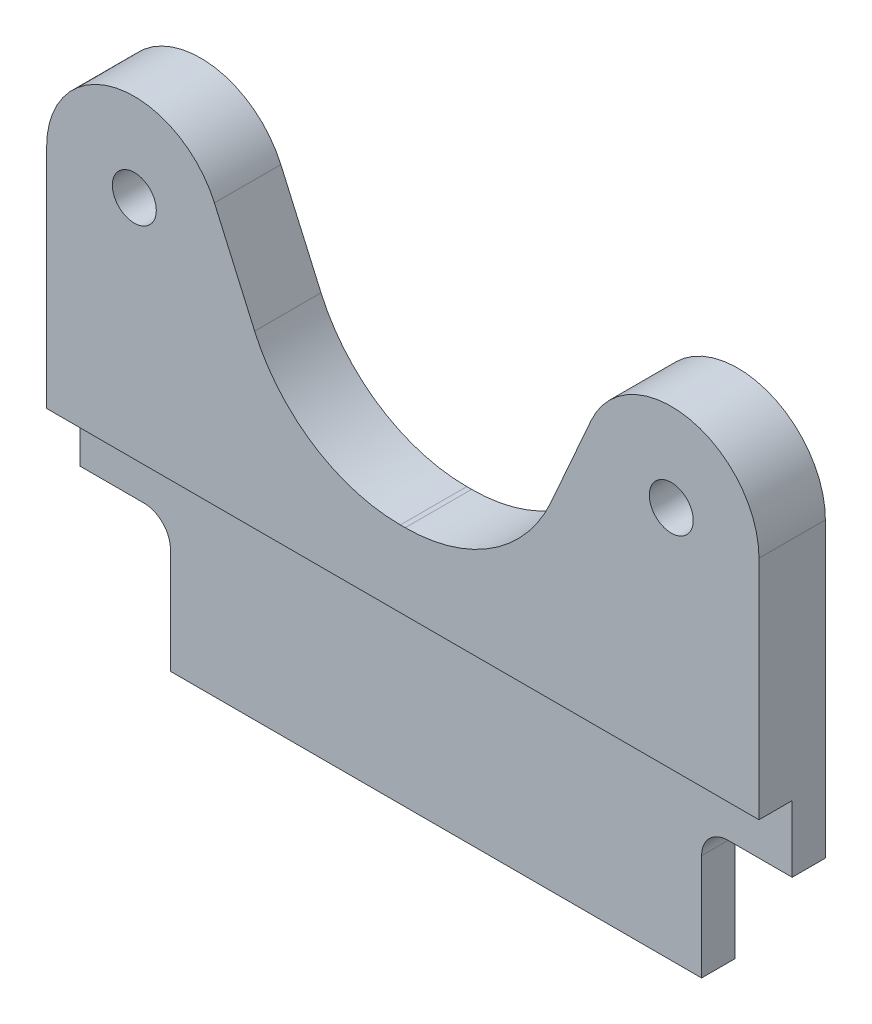
ISO-10303-21;
HEADER;
FILE_DESCRIPTION(('STEP AP214'),'2;1');
FILE_NAME('part.step','',(''),(''),'','','');
FILE_SCHEMA(('AUTOMOTIVE_DESIGN { 1 0 10303 214 1 1 1 1 }'));
ENDSEC;
DATA;
#1=APPLICATION_CONTEXT('core data for automotive mechanical design processes');
#2=APPLICATION_PROTOCOL_DEFINITION('international standard','automotive_design',2000,#1);
#3=PRODUCT_CONTEXT('',#1,'mechanical');
#4=PRODUCT('Part','Part','',(#3));
#5=PRODUCT_RELATED_PRODUCT_CATEGORY('part','',(#4));
#6=PRODUCT_DEFINITION_FORMATION('','',#4);
#7=PRODUCT_DEFINITION_CONTEXT('part definition',#1,'design');
#8=PRODUCT_DEFINITION('design','',#6,#7);
#9=PRODUCT_DEFINITION_SHAPE('','',#8);
#10=(LENGTH_UNIT() NAMED_UNIT(*) SI_UNIT(.MILLI.,.METRE.));
#11=(NAMED_UNIT(*) PLANE_ANGLE_UNIT() SI_UNIT($,.RADIAN.));
#12=(NAMED_UNIT(*) SI_UNIT($,.STERADIAN.) SOLID_ANGLE_UNIT());
#13=UNCERTAINTY_MEASURE_WITH_UNIT(LENGTH_MEASURE(1.E-05),#10,'distance_accuracy_value','');
#14=(GEOMETRIC_REPRESENTATION_CONTEXT(3) GLOBAL_UNCERTAINTY_ASSIGNED_CONTEXT((#13)) GLOBAL_UNIT_ASSIGNED_CONTEXT((#10,
#11,#12)) REPRESENTATION_CONTEXT('',''));
#15=CARTESIAN_POINT('',(0.,0.,0.));
#16=DIRECTION('',(0.,0.,1.));
#17=DIRECTION('',(1.,0.,0.));
#18=AXIS2_PLACEMENT_3D('',#15,#16,#17);
#19=CARTESIAN_POINT('',(-25.68120456473,27.9901804468508,3.175));
#20=DIRECTION('',(0.,0.,-1.));
#21=DIRECTION('',(-1.,0.,0.));
#22=AXIS2_PLACEMENT_3D('',#19,#20,#21);
#23=PLANE('',#22);
#24=CARTESIAN_POINT('',(25.6738643082025,27.9675894601776,3.175));
#25=DIRECTION('',(0.,0.,-1.));
#26=DIRECTION('',(-1.,0.,0.));
#27=AXIS2_PLACEMENT_3D('',#24,#25,#26);
#28=CIRCLE('',#27,2.1);
#29=CARTESIAN_POINT('',(23.5738643082025,27.9675894601776,3.175));
#30=VERTEX_POINT('',#29);
#31=EDGE_CURVE('E205',#30,#30,#28,.T.);
#32=ORIENTED_EDGE('',*,*,#31,.T.);
#33=EDGE_LOOP('',(#32));
#34=FACE_BOUND('',#33,.T.);
#35=CARTESIAN_POINT('',(-25.6738643082025,27.9675894601776,3.175));
#36=DIRECTION('',(0.,0.,1.));
#37=DIRECTION('',(1.,0.,0.));
#38=AXIS2_PLACEMENT_3D('',#35,#36,#37);
#39=CIRCLE('',#38,2.1);
#40=CARTESIAN_POINT('',(-23.5738643082025,27.9675894601776,3.175));
#41=VERTEX_POINT('',#40);
#42=EDGE_CURVE('E210',#41,#41,#39,.T.);
#43=ORIENTED_EDGE('',*,*,#42,.F.);
#44=EDGE_LOOP('',(#43));
#45=FACE_BOUND('',#44,.T.);
#46=DIRECTION('',(1.,0.,0.));
#47=VECTOR('',#46,1.);
#48=CARTESIAN_POINT('',(0.,6.32417558719147,3.175));
#49=LINE('',#48,#47);
#50=CARTESIAN_POINT('',(-34.06320456473,6.32417558719147,3.175));
#51=VERTEX_POINT('',#50);
#52=CARTESIAN_POINT('',(34.06320456473,6.32417558719147,3.175));
#53=VERTEX_POINT('',#52);
#54=EDGE_CURVE('E158',#51,#53,#49,.T.);
#55=ORIENTED_EDGE('',*,*,#54,.T.);
#56=DIRECTION('',(0.,1.,0.));
#57=VECTOR('',#56,1.);
#58=CARTESIAN_POINT('',(34.06320456473,27.9901804468508,3.175));
#59=LINE('',#58,#57);
#60=CARTESIAN_POINT('',(34.06320456473,27.9901804468508,3.175));
#61=VERTEX_POINT('',#60);
#62=EDGE_CURVE('E161',#53,#61,#59,.T.);
#63=ORIENTED_EDGE('',*,*,#62,.T.);
#64=CARTESIAN_POINT('',(25.6812045647298,27.9901804468508,3.175));
#65=DIRECTION('',(0.,0.,1.));
#66=DIRECTION('',(1.,0.,0.));
#67=AXIS2_PLACEMENT_3D('',#64,#65,#66);
#68=CIRCLE('',#67,8.382);
#69=CARTESIAN_POINT('',(18.0139264436061,31.3770329994929,3.175));
#70=VERTEX_POINT('',#69);
#71=EDGE_CURVE('E219',#61,#70,#68,.T.);
#72=ORIENTED_EDGE('',*,*,#71,.T.);
#73=DIRECTION('',(-0.40406258084491,-0.914731343488868,0.));
#74=VECTOR('',#73,1.);
#75=CARTESIAN_POINT('',(10.16,13.5970329994928,3.175));
#76=LINE('',#75,#74);
#77=CARTESIAN_POINT('',(14.1718131328884,22.6791192674164,3.175));
#78=VERTEX_POINT('',#77);
#79=EDGE_CURVE('E221',#70,#78,#76,.T.);
#80=ORIENTED_EDGE('',*,*,#79,.T.);
#81=CARTESIAN_POINT('',(0.231307458118071,28.8370329994928,3.175));
#82=DIRECTION('',(0.,0.,-1.));
#83=DIRECTION('',(-1.,0.,0.));
#84=AXIS2_PLACEMENT_3D('',#81,#82,#83);
#85=CIRCLE('',#84,15.24);
#86=CARTESIAN_POINT('',(0.231307458118071,13.5970329994928,3.175));
#87=VERTEX_POINT('',#86);
#88=EDGE_CURVE('E274',#78,#87,#85,.T.);
#89=ORIENTED_EDGE('',*,*,#88,.T.);
#90=DIRECTION('',(-1.,0.,0.));
#91=VECTOR('',#90,1.);
#92=CARTESIAN_POINT('',(10.16,13.5970329994928,3.175));
#93=LINE('',#92,#91);
#94=CARTESIAN_POINT('',(-0.231307458118167,13.5970329994928,3.175));
#95=VERTEX_POINT('',#94);
#96=EDGE_CURVE('E225',#87,#95,#93,.T.);
#97=ORIENTED_EDGE('',*,*,#96,.T.);
#98=CARTESIAN_POINT('',(-0.231307458118167,28.8370329994928,3.175));
#99=DIRECTION('',(0.,0.,-1.));
#100=DIRECTION('',(-1.,0.,0.));
#101=AXIS2_PLACEMENT_3D('',#98,#99,#100);
#102=CIRCLE('',#101,15.24);
#103=CARTESIAN_POINT('',(-14.1718131328885,22.6791192674163,3.175));
#104=VERTEX_POINT('',#103);
#105=EDGE_CURVE('E278',#95,#104,#102,.T.);
#106=ORIENTED_EDGE('',*,*,#105,.T.);
#107=DIRECTION('',(-0.404062580844919,0.914731343488865,0.));
#108=VECTOR('',#107,1.);
#109=CARTESIAN_POINT('',(-10.16,13.5970329994928,3.175));
#110=LINE('',#109,#108);
#111=CARTESIAN_POINT('',(-18.0139264436062,31.3770329994928,3.175));
#112=VERTEX_POINT('',#111);
#113=EDGE_CURVE('E228',#104,#112,#110,.T.);
#114=ORIENTED_EDGE('',*,*,#113,.T.);
#115=CARTESIAN_POINT('',(-25.68120456473,27.9901804468508,3.175));
#116=DIRECTION('',(0.,0.,1.));
#117=DIRECTION('',(-1.,0.,0.));
#118=AXIS2_PLACEMENT_3D('',#115,#116,#117);
#119=CIRCLE('',#118,8.382);
#120=CARTESIAN_POINT('',(-34.06320456473,27.9901804468508,3.175));
#121=VERTEX_POINT('',#120);
#122=EDGE_CURVE('E230',#112,#121,#119,.T.);
#123=ORIENTED_EDGE('',*,*,#122,.T.);
#124=DIRECTION('',(0.,1.,0.));
#125=VECTOR('',#124,1.);
#126=CARTESIAN_POINT('',(-34.06320456473,27.9901804468508,3.175));
#127=LINE('',#126,#125);
#128=EDGE_CURVE('E164',#51,#121,#127,.T.);
#129=ORIENTED_EDGE('',*,*,#128,.F.);
#130=EDGE_LOOP('',(#55,#63,#72,#80,#89,#97,#106,#114,#123,#129));
#131=FACE_BOUND('',#130,.T.);
#132=ADVANCED_FACE('F36',(#34,#45,#131),#23,.F.);
#133=CARTESIAN_POINT('',(34.06320456473,-0.0297176233327954,32.4487093196607));
#134=DIRECTION('',(0.,-1.,0.));
#135=DIRECTION('',(0.,0.,-1.));
#136=AXIS2_PLACEMENT_3D('',#133,#134,#135);
#137=PLANE('',#136);
#138=DIRECTION('',(1.,0.,0.));
#139=VECTOR('',#138,1.);
#140=CARTESIAN_POINT('',(34.06320456473,-0.0297176233327954,0.));
#141=LINE('',#140,#139);
#142=CARTESIAN_POINT('',(27.94,-0.0297176233327954,0.));
#143=VERTEX_POINT('',#142);
#144=CARTESIAN_POINT('',(34.06320456473,-0.0297176233327954,0.));
#145=VERTEX_POINT('',#144);
#146=EDGE_CURVE('E176',#143,#145,#141,.T.);
#147=ORIENTED_EDGE('',*,*,#146,.F.);
#148=DIRECTION('',(0.,0.,1.));
#149=VECTOR('',#148,1.);
#150=CARTESIAN_POINT('',(27.94,-0.0297176233327954,32.4487093196607));
#151=LINE('',#150,#149);
#152=CARTESIAN_POINT('',(27.94,-0.0297176233327954,-3.175));
#153=VERTEX_POINT('',#152);
#154=EDGE_CURVE('E283',#143,#153,#151,.F.);
#155=ORIENTED_EDGE('',*,*,#154,.T.);
#156=DIRECTION('',(-1.,0.,0.));
#157=VECTOR('',#156,1.);
#158=CARTESIAN_POINT('',(34.06320456473,-0.0297176233327954,-3.175));
#159=LINE('',#158,#157);
#160=CARTESIAN_POINT('',(34.06320456473,-0.0297176233327954,-3.175));
#161=VERTEX_POINT('',#160);
#162=EDGE_CURVE('E302',#161,#153,#159,.T.);
#163=ORIENTED_EDGE('',*,*,#162,.F.);
#164=DIRECTION('',(0.,0.,-1.));
#165=VECTOR('',#164,1.);
#166=CARTESIAN_POINT('',(34.06320456473,-0.0297176233327954,32.4487093196607));
#167=LINE('',#166,#165);
#168=EDGE_CURVE('E183',#145,#161,#167,.T.);
#169=ORIENTED_EDGE('',*,*,#168,.F.);
#170=EDGE_LOOP('',(#147,#155,#163,#169));
#171=FACE_BOUND('',#170,.T.);
#172=ADVANCED_FACE('F315',(#171),#137,.T.);
#173=CARTESIAN_POINT('',(34.06320456473,27.9901804468508,32.4487093196607));
#174=DIRECTION('',(1.,0.,0.));
#175=DIRECTION('',(0.,0.,-1.));
#176=AXIS2_PLACEMENT_3D('',#173,#174,#175);
#177=PLANE('',#176);
#178=ORIENTED_EDGE('',*,*,#62,.F.);
#179=DIRECTION('',(0.,0.,1.));
#180=VECTOR('',#179,1.);
#181=CARTESIAN_POINT('',(34.06320456473,6.32417558719147,-10.5927960614399));
#182=LINE('',#181,#180);
#183=CARTESIAN_POINT('',(34.06320456473,6.32417558719147,0.));
#184=VERTEX_POINT('',#183);
#185=EDGE_CURVE('E171',#184,#53,#182,.T.);
#186=ORIENTED_EDGE('',*,*,#185,.F.);
#187=DIRECTION('',(0.,1.,0.));
#188=VECTOR('',#187,1.);
#189=CARTESIAN_POINT('',(34.06320456473,6.32417558719147,0.));
#190=LINE('',#189,#188);
#191=EDGE_CURVE('E316',#145,#184,#190,.T.);
#192=ORIENTED_EDGE('',*,*,#191,.F.);
#193=ORIENTED_EDGE('',*,*,#168,.T.);
#194=DIRECTION('',(0.,-1.,0.));
#195=VECTOR('',#194,1.);
#196=CARTESIAN_POINT('',(34.06320456473,27.9901804468508,-3.175));
#197=LINE('',#196,#195);
#198=CARTESIAN_POINT('',(34.06320456473,27.9901804468508,-3.175));
#199=VERTEX_POINT('',#198);
#200=EDGE_CURVE('E327',#199,#161,#197,.T.);
#201=ORIENTED_EDGE('',*,*,#200,.F.);
#202=DIRECTION('',(0.,0.,-1.));
#203=VECTOR('',#202,1.);
#204=CARTESIAN_POINT('',(34.06320456473,27.9901804468508,32.4487093196607));
#205=LINE('',#204,#203);
#206=EDGE_CURVE('E180',#61,#199,#205,.T.);
#207=ORIENTED_EDGE('',*,*,#206,.F.);
#208=EDGE_LOOP('',(#178,#186,#192,#193,#201,#207));
#209=FACE_BOUND('',#208,.T.);
#210=ADVANCED_FACE('F178',(#209),#177,.T.);
#211=CARTESIAN_POINT('',(-34.06320456473,-0.0297176233327954,32.4487093196607));
#212=DIRECTION('',(0.,1.,0.));
#213=DIRECTION('',(0.,0.,1.));
#214=AXIS2_PLACEMENT_3D('',#211,#212,#213);
#215=PLANE('',#214);
#216=DIRECTION('',(1.,0.,0.));
#217=VECTOR('',#216,1.);
#218=CARTESIAN_POINT('',(-34.06320456473,-0.0297176233327954,-3.175));
#219=LINE('',#218,#217);
#220=CARTESIAN_POINT('',(-34.06320456473,-0.0297176233327954,-3.175));
#221=VERTEX_POINT('',#220);
#222=CARTESIAN_POINT('',(-27.94,-0.0297176233327954,-3.175));
#223=VERTEX_POINT('',#222);
#224=EDGE_CURVE('E186',#221,#223,#219,.T.);
#225=ORIENTED_EDGE('',*,*,#224,.T.);
#226=DIRECTION('',(0.,0.,1.));
#227=VECTOR('',#226,1.);
#228=CARTESIAN_POINT('',(-27.94,-0.0297176233327954,0.));
#229=LINE('',#228,#227);
#230=CARTESIAN_POINT('',(-27.94,-0.0297176233327954,0.));
#231=VERTEX_POINT('',#230);
#232=EDGE_CURVE('E285',#223,#231,#229,.T.);
#233=ORIENTED_EDGE('',*,*,#232,.T.);
#234=DIRECTION('',(-1.,0.,0.));
#235=VECTOR('',#234,1.);
#236=CARTESIAN_POINT('',(-34.06320456473,-0.0297176233327954,0.));
#237=LINE('',#236,#235);
#238=CARTESIAN_POINT('',(-34.06320456473,-0.0297176233327954,0.));
#239=VERTEX_POINT('',#238);
#240=EDGE_CURVE('E321',#231,#239,#237,.T.);
#241=ORIENTED_EDGE('',*,*,#240,.T.);
#242=DIRECTION('',(0.,0.,-1.));
#243=VECTOR('',#242,1.);
#244=CARTESIAN_POINT('',(-34.06320456473,-0.0297176233327954,32.4487093196607));
#245=LINE('',#244,#243);
#246=EDGE_CURVE('E193',#239,#221,#245,.T.);
#247=ORIENTED_EDGE('',*,*,#246,.T.);
#248=EDGE_LOOP('',(#225,#233,#241,#247));
#249=FACE_BOUND('',#248,.T.);
#250=ADVANCED_FACE('F368',(#249),#215,.F.);
#251=CARTESIAN_POINT('',(-25.68120456473,27.9901804468508,3.175));
#252=DIRECTION('',(0.,0.,-1.));
#253=DIRECTION('',(-1.,0.,0.));
#254=AXIS2_PLACEMENT_3D('',#251,#252,#253);
#255=CYLINDRICAL_SURFACE('',#254,8.382);
#256=DIRECTION('',(0.,0.,-1.));
#257=VECTOR('',#256,1.);
#258=CARTESIAN_POINT('',(-34.06320456473,27.9901804468508,32.4487093196607));
#259=LINE('',#258,#257);
#260=CARTESIAN_POINT('',(-34.06320456473,27.9901804468508,-3.175));
#261=VERTEX_POINT('',#260);
#262=EDGE_CURVE('E195',#121,#261,#259,.T.);
#263=ORIENTED_EDGE('',*,*,#262,.F.);
#264=ORIENTED_EDGE('',*,*,#122,.F.);
#265=DIRECTION('',(0.,0.,-1.));
#266=VECTOR('',#265,1.);
#267=CARTESIAN_POINT('',(-18.0139264436062,31.3770329994928,3.175));
#268=LINE('',#267,#266);
#269=CARTESIAN_POINT('',(-18.0139264436062,31.3770329994928,-3.175));
#270=VERTEX_POINT('',#269);
#271=EDGE_CURVE('E256',#112,#270,#268,.T.);
#272=ORIENTED_EDGE('',*,*,#271,.T.);
#273=CARTESIAN_POINT('',(-25.68120456473,27.9901804468508,-3.175));
#274=DIRECTION('',(0.,0.,1.));
#275=DIRECTION('',(-1.,0.,0.));
#276=AXIS2_PLACEMENT_3D('',#273,#274,#275);
#277=CIRCLE('',#276,8.382);
#278=EDGE_CURVE('E245',#270,#261,#277,.T.);
#279=ORIENTED_EDGE('',*,*,#278,.T.);
#280=EDGE_LOOP('',(#263,#264,#272,#279));
#281=FACE_BOUND('',#280,.T.);
#282=ADVANCED_FACE('F359',(#281),#255,.T.);
#283=CARTESIAN_POINT('',(25.4,0.,3.175));
#284=DIRECTION('',(-1.,0.,0.));
#285=DIRECTION('',(0.,-1.,0.));
#286=AXIS2_PLACEMENT_3D('',#283,#284,#285);
#287=PLANE('',#286);
#288=DIRECTION('',(0.,1.,0.));
#289=VECTOR('',#288,1.);
#290=CARTESIAN_POINT('',(25.4,0.,-3.175));
#291=LINE('',#290,#289);
#292=CARTESIAN_POINT('',(25.4,-12.7,-3.175));
#293=VERTEX_POINT('',#292);
#294=CARTESIAN_POINT('',(25.4,-2.56971762333279,-3.175));
#295=VERTEX_POINT('',#294);
#296=EDGE_CURVE('E216',#293,#295,#291,.T.);
#297=ORIENTED_EDGE('',*,*,#296,.T.);
#298=DIRECTION('',(0.,0.,1.));
#299=VECTOR('',#298,1.);
#300=CARTESIAN_POINT('',(25.4,-2.56971762333279,3.175));
#301=LINE('',#300,#299);
#302=CARTESIAN_POINT('',(25.4,-2.56971762333279,0.));
#303=VERTEX_POINT('',#302);
#304=EDGE_CURVE('E280',#295,#303,#301,.T.);
#305=ORIENTED_EDGE('',*,*,#304,.T.);
#306=DIRECTION('',(0.,1.,0.));
#307=VECTOR('',#306,1.);
#308=CARTESIAN_POINT('',(25.4,0.,0.));
#309=LINE('',#308,#307);
#310=CARTESIAN_POINT('',(25.4,-12.7,0.));
#311=VERTEX_POINT('',#310);
#312=EDGE_CURVE('E203',#311,#303,#309,.T.);
#313=ORIENTED_EDGE('',*,*,#312,.F.);
#314=DIRECTION('',(0.,0.,-1.));
#315=VECTOR('',#314,1.);
#316=CARTESIAN_POINT('',(25.4,-12.7,3.175));
#317=LINE('',#316,#315);
#318=EDGE_CURVE('E232',#311,#293,#317,.T.);
#319=ORIENTED_EDGE('',*,*,#318,.T.);
#320=EDGE_LOOP('',(#297,#305,#313,#319));
#321=FACE_BOUND('',#320,.T.);
#322=ADVANCED_FACE('F307',(#321),#287,.F.);
#323=CARTESIAN_POINT('',(-25.4,0.,3.175));
#324=DIRECTION('',(1.,0.,0.));
#325=DIRECTION('',(0.,1.,0.));
#326=AXIS2_PLACEMENT_3D('',#323,#324,#325);
#327=PLANE('',#326);
#328=DIRECTION('',(0.,-1.,0.));
#329=VECTOR('',#328,1.);
#330=CARTESIAN_POINT('',(-25.4,0.,0.));
#331=LINE('',#330,#329);
#332=CARTESIAN_POINT('',(-25.4,-2.56971762333279,0.));
#333=VERTEX_POINT('',#332);
#334=CARTESIAN_POINT('',(-25.4,-12.7,0.));
#335=VERTEX_POINT('',#334);
#336=EDGE_CURVE('E199',#333,#335,#331,.T.);
#337=ORIENTED_EDGE('',*,*,#336,.F.);
#338=DIRECTION('',(0.,0.,1.));
#339=VECTOR('',#338,1.);
#340=CARTESIAN_POINT('',(-25.4,-2.56971762333279,-3.175));
#341=LINE('',#340,#339);
#342=CARTESIAN_POINT('',(-25.4,-2.56971762333279,-3.175));
#343=VERTEX_POINT('',#342);
#344=EDGE_CURVE('E51',#333,#343,#341,.F.);
#345=ORIENTED_EDGE('',*,*,#344,.T.);
#346=DIRECTION('',(0.,-1.,0.));
#347=VECTOR('',#346,1.);
#348=CARTESIAN_POINT('',(-25.4,0.,-3.175));
#349=LINE('',#348,#347);
#350=CARTESIAN_POINT('',(-25.4,-12.7,-3.175));
#351=VERTEX_POINT('',#350);
#352=EDGE_CURVE('E248',#343,#351,#349,.T.);
#353=ORIENTED_EDGE('',*,*,#352,.T.);
#354=DIRECTION('',(0.,0.,-1.));
#355=VECTOR('',#354,1.);
#356=CARTESIAN_POINT('',(-25.4,-12.7,3.175));
#357=LINE('',#356,#355);
#358=EDGE_CURVE('E253',#335,#351,#357,.T.);
#359=ORIENTED_EDGE('',*,*,#358,.F.);
#360=EDGE_LOOP('',(#337,#345,#353,#359));
#361=FACE_BOUND('',#360,.T.);
#362=ADVANCED_FACE('F391',(#361),#327,.F.);
#363=CARTESIAN_POINT('',(-25.4,-12.7,3.175));
#364=DIRECTION('',(0.,1.,0.));
#365=DIRECTION('',(0.,0.,1.));
#366=AXIS2_PLACEMENT_3D('',#363,#364,#365);
#367=PLANE('',#366);
#368=DIRECTION('',(1.,0.,0.));
#369=VECTOR('',#368,1.);
#370=CARTESIAN_POINT('',(0.,-12.7,0.));
#371=LINE('',#370,#369);
#372=EDGE_CURVE('E201',#335,#311,#371,.T.);
#373=ORIENTED_EDGE('',*,*,#372,.F.);
#374=ORIENTED_EDGE('',*,*,#358,.T.);
#375=DIRECTION('',(1.,0.,0.));
#376=VECTOR('',#375,1.);
#377=CARTESIAN_POINT('',(-25.4,-12.7,-3.175));
#378=LINE('',#377,#376);
#379=EDGE_CURVE('E222',#351,#293,#378,.T.);
#380=ORIENTED_EDGE('',*,*,#379,.T.);
#381=ORIENTED_EDGE('',*,*,#318,.F.);
#382=EDGE_LOOP('',(#373,#374,#380,#381));
#383=FACE_BOUND('',#382,.T.);
#384=ADVANCED_FACE('F388',(#383),#367,.F.);
#385=CARTESIAN_POINT('',(25.6812045647298,27.9901804468508,3.175));
#386=DIRECTION('',(0.,0.,-1.));
#387=DIRECTION('',(-1.,0.,0.));
#388=AXIS2_PLACEMENT_3D('',#385,#386,#387);
#389=CYLINDRICAL_SURFACE('',#388,8.382);
#390=ORIENTED_EDGE('',*,*,#71,.F.);
#391=ORIENTED_EDGE('',*,*,#206,.T.);
#392=CARTESIAN_POINT('',(25.6812045647298,27.9901804468508,-3.175));
#393=DIRECTION('',(0.,0.,1.));
#394=DIRECTION('',(1.,0.,0.));
#395=AXIS2_PLACEMENT_3D('',#392,#393,#394);
#396=CIRCLE('',#395,8.382);
#397=CARTESIAN_POINT('',(18.0139264436061,31.3770329994929,-3.175));
#398=VERTEX_POINT('',#397);
#399=EDGE_CURVE('E235',#199,#398,#396,.T.);
#400=ORIENTED_EDGE('',*,*,#399,.T.);
#401=DIRECTION('',(0.,0.,-1.));
#402=VECTOR('',#401,1.);
#403=CARTESIAN_POINT('',(18.0139264436061,31.3770329994929,3.175));
#404=LINE('',#403,#402);
#405=EDGE_CURVE('E259',#70,#398,#404,.T.);
#406=ORIENTED_EDGE('',*,*,#405,.F.);
#407=EDGE_LOOP('',(#390,#391,#400,#406));
#408=FACE_BOUND('',#407,.T.);
#409=ADVANCED_FACE('F330',(#408),#389,.T.);
#410=CARTESIAN_POINT('',(10.16,13.5970329994928,3.175));
#411=DIRECTION('',(0.914731343488868,-0.40406258084491,0.));
#412=DIRECTION('',(0.40406258084491,0.914731343488868,0.));
#413=AXIS2_PLACEMENT_3D('',#410,#411,#412);
#414=PLANE('',#413);
#415=DIRECTION('',(-0.40406258084491,-0.914731343488868,0.));
#416=VECTOR('',#415,1.);
#417=CARTESIAN_POINT('',(10.16,13.5970329994928,-3.175));
#418=LINE('',#417,#416);
#419=CARTESIAN_POINT('',(14.1718131328884,22.6791192674164,-3.175));
#420=VERTEX_POINT('',#419);
#421=EDGE_CURVE('E237',#398,#420,#418,.T.);
#422=ORIENTED_EDGE('',*,*,#421,.T.);
#423=DIRECTION('',(0.,0.,-1.));
#424=VECTOR('',#423,1.);
#425=CARTESIAN_POINT('',(14.1718131328884,22.6791192674164,3.175));
#426=LINE('',#425,#424);
#427=EDGE_CURVE('E267',#420,#78,#426,.F.);
#428=ORIENTED_EDGE('',*,*,#427,.T.);
#429=ORIENTED_EDGE('',*,*,#79,.F.);
#430=ORIENTED_EDGE('',*,*,#405,.T.);
#431=EDGE_LOOP('',(#422,#428,#429,#430));
#432=FACE_BOUND('',#431,.T.);
#433=ADVANCED_FACE('F336',(#432),#414,.F.);
#434=CARTESIAN_POINT('',(10.16,13.5970329994928,3.175));
#435=DIRECTION('',(0.,-1.,0.));
#436=DIRECTION('',(0.,0.,-1.));
#437=AXIS2_PLACEMENT_3D('',#434,#435,#436);
#438=PLANE('',#437);
#439=ORIENTED_EDGE('',*,*,#96,.F.);
#440=DIRECTION('',(0.,0.,-1.));
#441=VECTOR('',#440,1.);
#442=CARTESIAN_POINT('',(0.231307458118071,13.5970329994928,-3.175));
#443=LINE('',#442,#441);
#444=CARTESIAN_POINT('',(0.231307458118071,13.5970329994928,-3.175));
#445=VERTEX_POINT('',#444);
#446=EDGE_CURVE('E264',#87,#445,#443,.T.);
#447=ORIENTED_EDGE('',*,*,#446,.T.);
#448=DIRECTION('',(-1.,0.,0.));
#449=VECTOR('',#448,1.);
#450=CARTESIAN_POINT('',(10.16,13.5970329994928,-3.175));
#451=LINE('',#450,#449);
#452=CARTESIAN_POINT('',(-0.231307458118167,13.5970329994928,-3.175));
#453=VERTEX_POINT('',#452);
#454=EDGE_CURVE('E240',#445,#453,#451,.T.);
#455=ORIENTED_EDGE('',*,*,#454,.T.);
#456=DIRECTION('',(0.,0.,-1.));
#457=VECTOR('',#456,1.);
#458=CARTESIAN_POINT('',(-0.231307458118167,13.5970329994928,3.175));
#459=LINE('',#458,#457);
#460=EDGE_CURVE('E262',#453,#95,#459,.F.);
#461=ORIENTED_EDGE('',*,*,#460,.T.);
#462=EDGE_LOOP('',(#439,#447,#455,#461));
#463=FACE_BOUND('',#462,.T.);
#464=ADVANCED_FACE('F345',(#463),#438,.F.);
#465=CARTESIAN_POINT('',(-10.16,13.5970329994928,3.175));
#466=DIRECTION('',(-0.914731343488865,-0.404062580844919,0.));
#467=DIRECTION('',(0.404062580844919,-0.914731343488865,0.));
#468=AXIS2_PLACEMENT_3D('',#465,#466,#467);
#469=PLANE('',#468);
#470=ORIENTED_EDGE('',*,*,#113,.F.);
#471=DIRECTION('',(0.,0.,-1.));
#472=VECTOR('',#471,1.);
#473=CARTESIAN_POINT('',(-14.1718131328885,22.6791192674163,-3.175));
#474=LINE('',#473,#472);
#475=CARTESIAN_POINT('',(-14.1718131328885,22.6791192674163,-3.175));
#476=VERTEX_POINT('',#475);
#477=EDGE_CURVE('E269',#104,#476,#474,.T.);
#478=ORIENTED_EDGE('',*,*,#477,.T.);
#479=DIRECTION('',(-0.404062580844919,0.914731343488865,0.));
#480=VECTOR('',#479,1.);
#481=CARTESIAN_POINT('',(-10.16,13.5970329994928,-3.175));
#482=LINE('',#481,#480);
#483=EDGE_CURVE('E243',#476,#270,#482,.T.);
#484=ORIENTED_EDGE('',*,*,#483,.T.);
#485=ORIENTED_EDGE('',*,*,#271,.F.);
#486=EDGE_LOOP('',(#470,#478,#484,#485));
#487=FACE_BOUND('',#486,.T.);
#488=ADVANCED_FACE('F353',(#487),#469,.F.);
#489=CARTESIAN_POINT('',(-25.68120456473,27.9901804468508,-3.175));
#490=DIRECTION('',(0.,0.,-1.));
#491=DIRECTION('',(-1.,0.,0.));
#492=AXIS2_PLACEMENT_3D('',#489,#490,#491);
#493=PLANE('',#492);
#494=ORIENTED_EDGE('',*,*,#399,.F.);
#495=ORIENTED_EDGE('',*,*,#200,.T.);
#496=ORIENTED_EDGE('',*,*,#162,.T.);
#497=CARTESIAN_POINT('',(27.94,-2.5697176233328,-3.175));
#498=DIRECTION('',(0.,0.,-1.));
#499=DIRECTION('',(-1.,0.,0.));
#500=AXIS2_PLACEMENT_3D('',#497,#498,#499);
#501=CIRCLE('',#500,2.54);
#502=EDGE_CURVE('E291',#153,#295,#501,.F.);
#503=ORIENTED_EDGE('',*,*,#502,.T.);
#504=ORIENTED_EDGE('',*,*,#296,.F.);
#505=ORIENTED_EDGE('',*,*,#379,.F.);
#506=ORIENTED_EDGE('',*,*,#352,.F.);
#507=CARTESIAN_POINT('',(-27.94,-2.5697176233328,-3.175));
#508=DIRECTION('',(0.,0.,-1.));
#509=DIRECTION('',(-1.,0.,0.));
#510=AXIS2_PLACEMENT_3D('',#507,#508,#509);
#511=CIRCLE('',#510,2.54);
#512=EDGE_CURVE('E11',#343,#223,#511,.F.);
#513=ORIENTED_EDGE('',*,*,#512,.T.);
#514=ORIENTED_EDGE('',*,*,#224,.F.);
#515=DIRECTION('',(0.,-1.,0.));
#516=VECTOR('',#515,1.);
#517=CARTESIAN_POINT('',(-34.06320456473,27.9901804468508,-3.175));
#518=LINE('',#517,#516);
#519=EDGE_CURVE('E182',#261,#221,#518,.T.);
#520=ORIENTED_EDGE('',*,*,#519,.F.);
#521=ORIENTED_EDGE('',*,*,#278,.F.);
#522=ORIENTED_EDGE('',*,*,#483,.F.);
#523=CARTESIAN_POINT('',(-0.231307458118167,28.8370329994928,-3.175));
#524=DIRECTION('',(0.,0.,-1.));
#525=DIRECTION('',(-1.,0.,0.));
#526=AXIS2_PLACEMENT_3D('',#523,#524,#525);
#527=CIRCLE('',#526,15.24);
#528=EDGE_CURVE('E276',#476,#453,#527,.F.);
#529=ORIENTED_EDGE('',*,*,#528,.T.);
#530=ORIENTED_EDGE('',*,*,#454,.F.);
#531=CARTESIAN_POINT('',(0.231307458118071,28.8370329994928,-3.175));
#532=DIRECTION('',(0.,0.,-1.));
#533=DIRECTION('',(-1.,0.,0.));
#534=AXIS2_PLACEMENT_3D('',#531,#532,#533);
#535=CIRCLE('',#534,15.24);
#536=EDGE_CURVE('E272',#445,#420,#535,.F.);
#537=ORIENTED_EDGE('',*,*,#536,.T.);
#538=ORIENTED_EDGE('',*,*,#421,.F.);
#539=EDGE_LOOP('',(#494,#495,#496,#503,#504,#505,#506,#513,#514,#520,#521,#522,#529,#530,#537,#538));
#540=FACE_BOUND('',#539,.T.);
#541=CARTESIAN_POINT('',(25.6738643082025,27.9675894601776,-3.175));
#542=DIRECTION('',(0.,0.,-1.));
#543=DIRECTION('',(-1.,0.,0.));
#544=AXIS2_PLACEMENT_3D('',#541,#542,#543);
#545=CIRCLE('',#544,2.1);
#546=CARTESIAN_POINT('',(23.5738643082025,27.9675894601776,-3.175));
#547=VERTEX_POINT('',#546);
#548=EDGE_CURVE('E207',#547,#547,#545,.T.);
#549=ORIENTED_EDGE('',*,*,#548,.F.);
#550=EDGE_LOOP('',(#549));
#551=FACE_BOUND('',#550,.T.);
#552=CARTESIAN_POINT('',(-25.6738643082025,27.9675894601776,-3.175));
#553=DIRECTION('',(0.,0.,1.));
#554=DIRECTION('',(1.,0.,0.));
#555=AXIS2_PLACEMENT_3D('',#552,#553,#554);
#556=CIRCLE('',#555,2.1);
#557=CARTESIAN_POINT('',(-23.5738643082025,27.9675894601776,-3.175));
#558=VERTEX_POINT('',#557);
#559=EDGE_CURVE('E213',#558,#558,#556,.T.);
#560=ORIENTED_EDGE('',*,*,#559,.T.);
#561=EDGE_LOOP('',(#560));
#562=FACE_BOUND('',#561,.T.);
#563=ADVANCED_FACE('F297',(#540,#551,#562),#493,.T.);
#564=CARTESIAN_POINT('',(-25.6738643082025,27.9675894601776,-3.175));
#565=DIRECTION('',(0.,0.,1.));
#566=DIRECTION('',(1.,0.,0.));
#567=AXIS2_PLACEMENT_3D('',#564,#565,#566);
#568=CYLINDRICAL_SURFACE('',#567,2.1);
#569=ORIENTED_EDGE('',*,*,#559,.F.);
#570=EDGE_LOOP('',(#569));
#571=FACE_BOUND('',#570,.T.);
#572=ORIENTED_EDGE('',*,*,#42,.T.);
#573=EDGE_LOOP('',(#572));
#574=FACE_BOUND('',#573,.T.);
#575=ADVANCED_FACE('F384',(#571,#574),#568,.F.);
#576=CARTESIAN_POINT('',(25.6738643082025,27.9675894601776,-3.175));
#577=DIRECTION('',(0.,0.,1.));
#578=DIRECTION('',(1.,0.,0.));
#579=AXIS2_PLACEMENT_3D('',#576,#577,#578);
#580=CYLINDRICAL_SURFACE('',#579,2.1);
#581=ORIENTED_EDGE('',*,*,#548,.T.);
#582=EDGE_LOOP('',(#581));
#583=FACE_BOUND('',#582,.T.);
#584=ORIENTED_EDGE('',*,*,#31,.F.);
#585=EDGE_LOOP('',(#584));
#586=FACE_BOUND('',#585,.T.);
#587=ADVANCED_FACE('F421',(#583,#586),#580,.F.);
#588=CARTESIAN_POINT('',(0.,6.32417558719147,0.));
#589=DIRECTION('',(0.,-1.,0.));
#590=DIRECTION('',(0.,0.,-1.));
#591=AXIS2_PLACEMENT_3D('',#588,#589,#590);
#592=PLANE('',#591);
#593=ORIENTED_EDGE('',*,*,#54,.F.);
#594=DIRECTION('',(0.,0.,1.));
#595=VECTOR('',#594,1.);
#596=CARTESIAN_POINT('',(-34.06320456473,6.32417558719147,-10.5927960614399));
#597=LINE('',#596,#595);
#598=CARTESIAN_POINT('',(-34.06320456473,6.32417558719147,0.));
#599=VERTEX_POINT('',#598);
#600=EDGE_CURVE('E318',#599,#51,#597,.T.);
#601=ORIENTED_EDGE('',*,*,#600,.F.);
#602=DIRECTION('',(1.,0.,0.));
#603=VECTOR('',#602,1.);
#604=CARTESIAN_POINT('',(0.,6.32417558719147,0.));
#605=LINE('',#604,#603);
#606=EDGE_CURVE('E168',#599,#184,#605,.T.);
#607=ORIENTED_EDGE('',*,*,#606,.T.);
#608=ORIENTED_EDGE('',*,*,#185,.T.);
#609=EDGE_LOOP('',(#593,#601,#607,#608));
#610=FACE_BOUND('',#609,.T.);
#611=ADVANCED_FACE('F172',(#610),#592,.T.);
#612=CARTESIAN_POINT('',(0.,0.,0.));
#613=DIRECTION('',(0.,0.,1.));
#614=DIRECTION('',(1.,0.,0.));
#615=AXIS2_PLACEMENT_3D('',#612,#613,#614);
#616=PLANE('',#615);
#617=ORIENTED_EDGE('',*,*,#191,.T.);
#618=ORIENTED_EDGE('',*,*,#606,.F.);
#619=DIRECTION('',(0.,1.,0.));
#620=VECTOR('',#619,1.);
#621=CARTESIAN_POINT('',(-34.06320456473,6.32417558719147,0.));
#622=LINE('',#621,#620);
#623=EDGE_CURVE('E323',#239,#599,#622,.T.);
#624=ORIENTED_EDGE('',*,*,#623,.F.);
#625=ORIENTED_EDGE('',*,*,#240,.F.);
#626=CARTESIAN_POINT('',(-27.94,-2.5697176233328,0.));
#627=DIRECTION('',(0.,0.,1.));
#628=DIRECTION('',(1.,0.,0.));
#629=AXIS2_PLACEMENT_3D('',#626,#627,#628);
#630=CIRCLE('',#629,2.54);
#631=EDGE_CURVE('E44',#231,#333,#630,.F.);
#632=ORIENTED_EDGE('',*,*,#631,.T.);
#633=ORIENTED_EDGE('',*,*,#336,.T.);
#634=ORIENTED_EDGE('',*,*,#372,.T.);
#635=ORIENTED_EDGE('',*,*,#312,.T.);
#636=CARTESIAN_POINT('',(27.94,-2.5697176233328,0.));
#637=DIRECTION('',(0.,0.,1.));
#638=DIRECTION('',(1.,0.,0.));
#639=AXIS2_PLACEMENT_3D('',#636,#637,#638);
#640=CIRCLE('',#639,2.54);
#641=EDGE_CURVE('E289',#303,#143,#640,.F.);
#642=ORIENTED_EDGE('',*,*,#641,.T.);
#643=ORIENTED_EDGE('',*,*,#146,.T.);
#644=EDGE_LOOP('',(#617,#618,#624,#625,#632,#633,#634,#635,#642,#643));
#645=FACE_BOUND('',#644,.T.);
#646=ADVANCED_FACE('F312',(#645),#616,.T.);
#647=CARTESIAN_POINT('',(0.231307458118071,28.8370329994928,3.175));
#648=DIRECTION('',(0.,0.,1.));
#649=DIRECTION('',(1.,0.,0.));
#650=AXIS2_PLACEMENT_3D('',#647,#648,#649);
#651=CYLINDRICAL_SURFACE('',#650,15.24);
#652=ORIENTED_EDGE('',*,*,#88,.F.);
#653=ORIENTED_EDGE('',*,*,#427,.F.);
#654=ORIENTED_EDGE('',*,*,#536,.F.);
#655=ORIENTED_EDGE('',*,*,#446,.F.);
#656=EDGE_LOOP('',(#652,#653,#654,#655));
#657=FACE_BOUND('',#656,.T.);
#658=ADVANCED_FACE('F340',(#657),#651,.F.);
#659=CARTESIAN_POINT('',(-0.231307458118167,28.8370329994928,3.175));
#660=DIRECTION('',(0.,0.,1.));
#661=DIRECTION('',(1.,0.,0.));
#662=AXIS2_PLACEMENT_3D('',#659,#660,#661);
#663=CYLINDRICAL_SURFACE('',#662,15.24);
#664=ORIENTED_EDGE('',*,*,#105,.F.);
#665=ORIENTED_EDGE('',*,*,#460,.F.);
#666=ORIENTED_EDGE('',*,*,#528,.F.);
#667=ORIENTED_EDGE('',*,*,#477,.F.);
#668=EDGE_LOOP('',(#664,#665,#666,#667));
#669=FACE_BOUND('',#668,.T.);
#670=ADVANCED_FACE('F348',(#669),#663,.F.);
#671=CARTESIAN_POINT('',(-34.06320456473,27.9901804468508,32.4487093196607));
#672=DIRECTION('',(1.,0.,0.));
#673=DIRECTION('',(0.,0.,-1.));
#674=AXIS2_PLACEMENT_3D('',#671,#672,#673);
#675=PLANE('',#674);
#676=ORIENTED_EDGE('',*,*,#623,.T.);
#677=ORIENTED_EDGE('',*,*,#600,.T.);
#678=ORIENTED_EDGE('',*,*,#128,.T.);
#679=ORIENTED_EDGE('',*,*,#262,.T.);
#680=ORIENTED_EDGE('',*,*,#519,.T.);
#681=ORIENTED_EDGE('',*,*,#246,.F.);
#682=EDGE_LOOP('',(#676,#677,#678,#679,#680,#681));
#683=FACE_BOUND('',#682,.T.);
#684=ADVANCED_FACE('F362',(#683),#675,.F.);
#685=CARTESIAN_POINT('',(27.94,-2.5697176233328,3.175));
#686=DIRECTION('',(0.,0.,1.));
#687=DIRECTION('',(1.,0.,0.));
#688=AXIS2_PLACEMENT_3D('',#685,#686,#687);
#689=CYLINDRICAL_SURFACE('',#688,2.54);
#690=ORIENTED_EDGE('',*,*,#502,.F.);
#691=ORIENTED_EDGE('',*,*,#154,.F.);
#692=ORIENTED_EDGE('',*,*,#641,.F.);
#693=ORIENTED_EDGE('',*,*,#304,.F.);
#694=EDGE_LOOP('',(#690,#691,#692,#693));
#695=FACE_BOUND('',#694,.T.);
#696=ADVANCED_FACE('F310',(#695),#689,.F.);
#697=CARTESIAN_POINT('',(-27.94,-2.5697176233328,32.4487093196607));
#698=DIRECTION('',(0.,0.,-1.));
#699=DIRECTION('',(-1.,0.,0.));
#700=AXIS2_PLACEMENT_3D('',#697,#698,#699);
#701=CYLINDRICAL_SURFACE('',#700,2.54);
#702=ORIENTED_EDGE('',*,*,#512,.F.);
#703=ORIENTED_EDGE('',*,*,#344,.F.);
#704=ORIENTED_EDGE('',*,*,#631,.F.);
#705=ORIENTED_EDGE('',*,*,#232,.F.);
#706=EDGE_LOOP('',(#702,#703,#704,#705));
#707=FACE_BOUND('',#706,.T.);
#708=ADVANCED_FACE('F38',(#707),#701,.F.);
#709=CLOSED_SHELL('',(#132,#172,#210,#250,#282,#322,#362,#384,#409,#433,#464,#488,#563,#575,
#587,#611,#646,#658,#670,#684,#696,#708));
#710=MANIFOLD_SOLID_BREP('B2',#709);
#711=ADVANCED_BREP_SHAPE_REPRESENTATION('',(#18,#710),#14);
#712=SHAPE_DEFINITION_REPRESENTATION(#9,#711);
ENDSEC;
END-ISO-10303-21;
